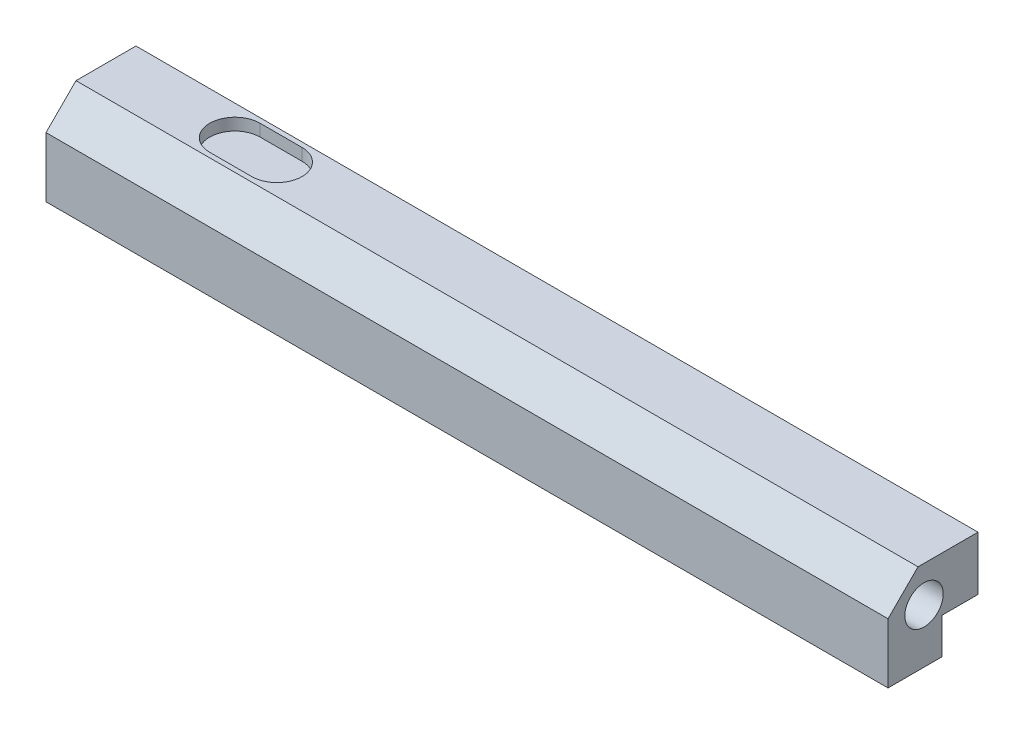
ISO-10303-21;
HEADER;
FILE_DESCRIPTION(('STEP AP214'),'2;1');
FILE_NAME('part.step','',(''),(''),'','','');
FILE_SCHEMA(('AUTOMOTIVE_DESIGN { 1 0 10303 214 1 1 1 1 }'));
ENDSEC;
DATA;
#1=APPLICATION_CONTEXT('core data for automotive mechanical design processes');
#2=APPLICATION_PROTOCOL_DEFINITION('international standard','automotive_design',2000,#1);
#3=PRODUCT_CONTEXT('',#1,'mechanical');
#4=PRODUCT('Part','Part','',(#3));
#5=PRODUCT_RELATED_PRODUCT_CATEGORY('part','',(#4));
#6=PRODUCT_DEFINITION_FORMATION('','',#4);
#7=PRODUCT_DEFINITION_CONTEXT('part definition',#1,'design');
#8=PRODUCT_DEFINITION('design','',#6,#7);
#9=PRODUCT_DEFINITION_SHAPE('','',#8);
#10=(LENGTH_UNIT() NAMED_UNIT(*) SI_UNIT(.MILLI.,.METRE.));
#11=(NAMED_UNIT(*) PLANE_ANGLE_UNIT() SI_UNIT($,.RADIAN.));
#12=(NAMED_UNIT(*) SI_UNIT($,.STERADIAN.) SOLID_ANGLE_UNIT());
#13=UNCERTAINTY_MEASURE_WITH_UNIT(LENGTH_MEASURE(1.E-05),#10,'distance_accuracy_value','');
#14=(GEOMETRIC_REPRESENTATION_CONTEXT(3) GLOBAL_UNCERTAINTY_ASSIGNED_CONTEXT((#13)) GLOBAL_UNIT_ASSIGNED_CONTEXT((#10,
#11,#12)) REPRESENTATION_CONTEXT('',''));
#15=CARTESIAN_POINT('',(0.,0.,0.));
#16=DIRECTION('',(0.,0.,1.));
#17=DIRECTION('',(1.,0.,0.));
#18=AXIS2_PLACEMENT_3D('',#15,#16,#17);
#19=CARTESIAN_POINT('',(70.2,-1.5,-1.5));
#20=DIRECTION('',(-1.,0.,0.));
#21=DIRECTION('',(0.,0.,1.));
#22=AXIS2_PLACEMENT_3D('',#19,#20,#21);
#23=CYLINDRICAL_SURFACE('',#22,2.35);
#24=CARTESIAN_POINT('',(-63.2,-1.5,-1.5));
#25=DIRECTION('',(-1.,0.,0.));
#26=DIRECTION('',(0.,0.,1.));
#27=AXIS2_PLACEMENT_3D('',#24,#25,#26);
#28=CIRCLE('',#27,2.35);
#29=CARTESIAN_POINT('',(-63.2,-1.5,0.849999999999998));
#30=VERTEX_POINT('',#29);
#31=EDGE_CURVE('E189',#30,#30,#28,.T.);
#32=ORIENTED_EDGE('',*,*,#31,.T.);
#33=EDGE_LOOP('',(#32));
#34=FACE_BOUND('',#33,.T.);
#35=CARTESIAN_POINT('',(63.2,-1.5,-1.5));
#36=DIRECTION('',(1.,0.,0.));
#37=DIRECTION('',(0.,0.,-1.));
#38=AXIS2_PLACEMENT_3D('',#35,#36,#37);
#39=CIRCLE('',#38,2.35);
#40=CARTESIAN_POINT('',(63.2,-1.5,-3.85));
#41=VERTEX_POINT('',#40);
#42=EDGE_CURVE('E175',#41,#41,#39,.T.);
#43=ORIENTED_EDGE('',*,*,#42,.T.);
#44=EDGE_LOOP('',(#43));
#45=FACE_BOUND('',#44,.T.);
#46=ADVANCED_FACE('F45',(#34,#45),#23,.F.);
#47=CARTESIAN_POINT('',(70.2,0.,0.));
#48=DIRECTION('',(-1.,0.,0.));
#49=DIRECTION('',(0.,0.,1.));
#50=AXIS2_PLACEMENT_3D('',#47,#48,#49);
#51=PLANE('',#50);
#52=CARTESIAN_POINT('',(70.2,-1.5,-1.5));
#53=DIRECTION('',(1.,0.,0.));
#54=DIRECTION('',(0.,0.,-1.));
#55=AXIS2_PLACEMENT_3D('',#52,#53,#54);
#56=CIRCLE('',#55,3.2);
#57=CARTESIAN_POINT('',(70.2,-1.5,-4.7));
#58=VERTEX_POINT('',#57);
#59=EDGE_CURVE('E184',#58,#58,#56,.T.);
#60=ORIENTED_EDGE('',*,*,#59,.F.);
#61=EDGE_LOOP('',(#60));
#62=FACE_BOUND('',#61,.T.);
#63=DIRECTION('',(0.,0.,1.));
#64=VECTOR('',#63,1.);
#65=CARTESIAN_POINT('',(70.2,4.5,4.5));
#66=LINE('',#65,#64);
#67=CARTESIAN_POINT('',(70.2,4.5,-10.5));
#68=VERTEX_POINT('',#67);
#69=CARTESIAN_POINT('',(70.2,4.5,-0.500000000000033));
#70=VERTEX_POINT('',#69);
#71=EDGE_CURVE('E219',#68,#70,#66,.T.);
#72=ORIENTED_EDGE('',*,*,#71,.T.);
#73=DIRECTION('',(0.,0.707106781186546,-0.707106781186549));
#74=VECTOR('',#73,1.);
#75=CARTESIAN_POINT('',(70.2,-0.500000000000004,4.5));
#76=LINE('',#75,#74);
#77=CARTESIAN_POINT('',(70.2,-0.500000000000004,4.5));
#78=VERTEX_POINT('',#77);
#79=EDGE_CURVE('E11',#70,#78,#76,.F.);
#80=ORIENTED_EDGE('',*,*,#79,.T.);
#81=DIRECTION('',(0.,-1.,0.));
#82=VECTOR('',#81,1.);
#83=CARTESIAN_POINT('',(70.2,-10.5,4.5));
#84=LINE('',#83,#82);
#85=CARTESIAN_POINT('',(70.2,-10.5,4.5));
#86=VERTEX_POINT('',#85);
#87=EDGE_CURVE('E222',#78,#86,#84,.T.);
#88=ORIENTED_EDGE('',*,*,#87,.T.);
#89=DIRECTION('',(0.,0.,-1.));
#90=VECTOR('',#89,1.);
#91=CARTESIAN_POINT('',(70.2,-10.5,-4.5));
#92=LINE('',#91,#90);
#93=CARTESIAN_POINT('',(70.2,-10.5,-4.5));
#94=VERTEX_POINT('',#93);
#95=EDGE_CURVE('E205',#86,#94,#92,.T.);
#96=ORIENTED_EDGE('',*,*,#95,.T.);
#97=DIRECTION('',(0.,1.,0.));
#98=VECTOR('',#97,1.);
#99=CARTESIAN_POINT('',(70.2,-4.5,-4.5));
#100=LINE('',#99,#98);
#101=CARTESIAN_POINT('',(70.2,-4.5,-4.5));
#102=VERTEX_POINT('',#101);
#103=EDGE_CURVE('E209',#94,#102,#100,.T.);
#104=ORIENTED_EDGE('',*,*,#103,.T.);
#105=DIRECTION('',(0.,0.,-1.));
#106=VECTOR('',#105,1.);
#107=CARTESIAN_POINT('',(70.2,-4.5,-10.5));
#108=LINE('',#107,#106);
#109=CARTESIAN_POINT('',(70.2,-4.5,-10.5));
#110=VERTEX_POINT('',#109);
#111=EDGE_CURVE('E213',#102,#110,#108,.T.);
#112=ORIENTED_EDGE('',*,*,#111,.T.);
#113=DIRECTION('',(0.,1.,0.));
#114=VECTOR('',#113,1.);
#115=CARTESIAN_POINT('',(70.2,4.5,-10.5));
#116=LINE('',#115,#114);
#117=EDGE_CURVE('E216',#110,#68,#116,.T.);
#118=ORIENTED_EDGE('',*,*,#117,.T.);
#119=EDGE_LOOP('',(#72,#80,#88,#96,#104,#112,#118));
#120=FACE_BOUND('',#119,.T.);
#121=ADVANCED_FACE('F282',(#62,#120),#51,.F.);
#122=CARTESIAN_POINT('',(-70.2,0.,0.));
#123=DIRECTION('',(-1.,0.,0.));
#124=DIRECTION('',(0.,0.,1.));
#125=AXIS2_PLACEMENT_3D('',#122,#123,#124);
#126=PLANE('',#125);
#127=CARTESIAN_POINT('',(-70.2,-1.5,-1.5));
#128=DIRECTION('',(-1.,0.,0.));
#129=DIRECTION('',(0.,0.,1.));
#130=AXIS2_PLACEMENT_3D('',#127,#128,#129);
#131=CIRCLE('',#130,3.2);
#132=CARTESIAN_POINT('',(-70.2,-1.5,1.7));
#133=VERTEX_POINT('',#132);
#134=EDGE_CURVE('E196',#133,#133,#131,.T.);
#135=ORIENTED_EDGE('',*,*,#134,.F.);
#136=EDGE_LOOP('',(#135));
#137=FACE_BOUND('',#136,.T.);
#138=DIRECTION('',(0.,-1.,0.));
#139=VECTOR('',#138,1.);
#140=CARTESIAN_POINT('',(-70.2,-10.5,4.5));
#141=LINE('',#140,#139);
#142=CARTESIAN_POINT('',(-70.2,-0.500000000000004,4.5));
#143=VERTEX_POINT('',#142);
#144=CARTESIAN_POINT('',(-70.2,-10.5,4.5));
#145=VERTEX_POINT('',#144);
#146=EDGE_CURVE('E210',#143,#145,#141,.T.);
#147=ORIENTED_EDGE('',*,*,#146,.F.);
#148=DIRECTION('',(0.,-0.707106781186546,0.707106781186549));
#149=VECTOR('',#148,1.);
#150=CARTESIAN_POINT('',(-70.2,2.,1.99999999999998));
#151=LINE('',#150,#149);
#152=CARTESIAN_POINT('',(-70.2,4.5,-0.500000000000033));
#153=VERTEX_POINT('',#152);
#154=EDGE_CURVE('E266',#143,#153,#151,.F.);
#155=ORIENTED_EDGE('',*,*,#154,.T.);
#156=DIRECTION('',(0.,0.,1.));
#157=VECTOR('',#156,1.);
#158=CARTESIAN_POINT('',(-70.2,4.5,4.5));
#159=LINE('',#158,#157);
#160=CARTESIAN_POINT('',(-70.2,4.5,-10.5));
#161=VERTEX_POINT('',#160);
#162=EDGE_CURVE('E238',#161,#153,#159,.T.);
#163=ORIENTED_EDGE('',*,*,#162,.F.);
#164=DIRECTION('',(0.,1.,0.));
#165=VECTOR('',#164,1.);
#166=CARTESIAN_POINT('',(-70.2,4.5,-10.5));
#167=LINE('',#166,#165);
#168=CARTESIAN_POINT('',(-70.2,-4.5,-10.5));
#169=VERTEX_POINT('',#168);
#170=EDGE_CURVE('E235',#169,#161,#167,.T.);
#171=ORIENTED_EDGE('',*,*,#170,.F.);
#172=DIRECTION('',(0.,0.,-1.));
#173=VECTOR('',#172,1.);
#174=CARTESIAN_POINT('',(-70.2,-4.5,-10.5));
#175=LINE('',#174,#173);
#176=CARTESIAN_POINT('',(-70.2,-4.5,-4.5));
#177=VERTEX_POINT('',#176);
#178=EDGE_CURVE('E232',#177,#169,#175,.T.);
#179=ORIENTED_EDGE('',*,*,#178,.F.);
#180=DIRECTION('',(0.,1.,0.));
#181=VECTOR('',#180,1.);
#182=CARTESIAN_POINT('',(-70.2,-4.5,-4.5));
#183=LINE('',#182,#181);
#184=CARTESIAN_POINT('',(-70.2,-10.5,-4.5));
#185=VERTEX_POINT('',#184);
#186=EDGE_CURVE('E229',#185,#177,#183,.T.);
#187=ORIENTED_EDGE('',*,*,#186,.F.);
#188=DIRECTION('',(0.,0.,-1.));
#189=VECTOR('',#188,1.);
#190=CARTESIAN_POINT('',(-70.2,-10.5,-4.5));
#191=LINE('',#190,#189);
#192=EDGE_CURVE('E201',#145,#185,#191,.T.);
#193=ORIENTED_EDGE('',*,*,#192,.F.);
#194=EDGE_LOOP('',(#147,#155,#163,#171,#179,#187,#193));
#195=FACE_BOUND('',#194,.T.);
#196=ADVANCED_FACE('F272',(#137,#195),#126,.T.);
#197=CARTESIAN_POINT('',(70.2,-10.5,-4.5));
#198=DIRECTION('',(0.,1.,0.));
#199=DIRECTION('',(0.,0.,1.));
#200=AXIS2_PLACEMENT_3D('',#197,#198,#199);
#201=PLANE('',#200);
#202=ORIENTED_EDGE('',*,*,#192,.T.);
#203=DIRECTION('',(-1.,0.,0.));
#204=VECTOR('',#203,1.);
#205=CARTESIAN_POINT('',(70.2,-10.5,-4.5));
#206=LINE('',#205,#204);
#207=EDGE_CURVE('E258',#94,#185,#206,.T.);
#208=ORIENTED_EDGE('',*,*,#207,.F.);
#209=ORIENTED_EDGE('',*,*,#95,.F.);
#210=DIRECTION('',(-1.,0.,0.));
#211=VECTOR('',#210,1.);
#212=CARTESIAN_POINT('',(70.2,-10.5,4.5));
#213=LINE('',#212,#211);
#214=EDGE_CURVE('E225',#86,#145,#213,.T.);
#215=ORIENTED_EDGE('',*,*,#214,.T.);
#216=EDGE_LOOP('',(#202,#208,#209,#215));
#217=FACE_BOUND('',#216,.T.);
#218=ADVANCED_FACE('F289',(#217),#201,.F.);
#219=CARTESIAN_POINT('',(70.2,-4.5,-4.5));
#220=DIRECTION('',(0.,0.,1.));
#221=DIRECTION('',(1.,0.,0.));
#222=AXIS2_PLACEMENT_3D('',#219,#220,#221);
#223=PLANE('',#222);
#224=ORIENTED_EDGE('',*,*,#186,.T.);
#225=DIRECTION('',(-1.,0.,0.));
#226=VECTOR('',#225,1.);
#227=CARTESIAN_POINT('',(70.2,-4.5,-4.5));
#228=LINE('',#227,#226);
#229=EDGE_CURVE('E254',#102,#177,#228,.T.);
#230=ORIENTED_EDGE('',*,*,#229,.F.);
#231=ORIENTED_EDGE('',*,*,#103,.F.);
#232=ORIENTED_EDGE('',*,*,#207,.T.);
#233=EDGE_LOOP('',(#224,#230,#231,#232));
#234=FACE_BOUND('',#233,.T.);
#235=ADVANCED_FACE('F294',(#234),#223,.F.);
#236=CARTESIAN_POINT('',(70.2,-4.5,-10.5));
#237=DIRECTION('',(0.,1.,0.));
#238=DIRECTION('',(0.,0.,1.));
#239=AXIS2_PLACEMENT_3D('',#236,#237,#238);
#240=PLANE('',#239);
#241=ORIENTED_EDGE('',*,*,#178,.T.);
#242=DIRECTION('',(-1.,0.,0.));
#243=VECTOR('',#242,1.);
#244=CARTESIAN_POINT('',(70.2,-4.5,-10.5));
#245=LINE('',#244,#243);
#246=EDGE_CURVE('E250',#110,#169,#245,.T.);
#247=ORIENTED_EDGE('',*,*,#246,.F.);
#248=ORIENTED_EDGE('',*,*,#111,.F.);
#249=ORIENTED_EDGE('',*,*,#229,.T.);
#250=EDGE_LOOP('',(#241,#247,#248,#249));
#251=FACE_BOUND('',#250,.T.);
#252=ADVANCED_FACE('F297',(#251),#240,.F.);
#253=CARTESIAN_POINT('',(70.2,4.5,-10.5));
#254=DIRECTION('',(0.,0.,1.));
#255=DIRECTION('',(0.,-1.,0.));
#256=AXIS2_PLACEMENT_3D('',#253,#254,#255);
#257=PLANE('',#256);
#258=ORIENTED_EDGE('',*,*,#170,.T.);
#259=DIRECTION('',(-1.,0.,0.));
#260=VECTOR('',#259,1.);
#261=CARTESIAN_POINT('',(70.2,4.5,-10.5));
#262=LINE('',#261,#260);
#263=EDGE_CURVE('E246',#68,#161,#262,.T.);
#264=ORIENTED_EDGE('',*,*,#263,.F.);
#265=ORIENTED_EDGE('',*,*,#117,.F.);
#266=ORIENTED_EDGE('',*,*,#246,.T.);
#267=EDGE_LOOP('',(#258,#264,#265,#266));
#268=FACE_BOUND('',#267,.T.);
#269=ADVANCED_FACE('F300',(#268),#257,.F.);
#270=CARTESIAN_POINT('',(70.2,4.5,4.5));
#271=DIRECTION('',(0.,-1.,0.));
#272=DIRECTION('',(0.,0.,-1.));
#273=AXIS2_PLACEMENT_3D('',#270,#271,#272);
#274=PLANE('',#273);
#275=DIRECTION('',(1.,0.,0.));
#276=VECTOR('',#275,1.);
#277=CARTESIAN_POINT('',(-48.7,4.5,-1.30000000000002));
#278=LINE('',#277,#276);
#279=CARTESIAN_POINT('',(-48.7,4.5,-1.30000000000002));
#280=VERTEX_POINT('',#279);
#281=CARTESIAN_POINT('',(-41.7,4.5,-1.30000000000002));
#282=VERTEX_POINT('',#281);
#283=EDGE_CURVE('E166',#280,#282,#278,.T.);
#284=ORIENTED_EDGE('',*,*,#283,.F.);
#285=CARTESIAN_POINT('',(-48.7,4.5,-5.50000000000002));
#286=DIRECTION('',(0.,1.,0.));
#287=DIRECTION('',(0.,0.,1.));
#288=AXIS2_PLACEMENT_3D('',#285,#286,#287);
#289=CIRCLE('',#288,4.2);
#290=CARTESIAN_POINT('',(-48.7,4.5,-9.70000000000001));
#291=VERTEX_POINT('',#290);
#292=EDGE_CURVE('E62',#291,#280,#289,.T.);
#293=ORIENTED_EDGE('',*,*,#292,.F.);
#294=DIRECTION('',(-1.,0.,0.));
#295=VECTOR('',#294,1.);
#296=CARTESIAN_POINT('',(-48.7,4.5,-9.70000000000001));
#297=LINE('',#296,#295);
#298=CARTESIAN_POINT('',(-41.7,4.5,-9.70000000000002));
#299=VERTEX_POINT('',#298);
#300=EDGE_CURVE('E153',#299,#291,#297,.T.);
#301=ORIENTED_EDGE('',*,*,#300,.F.);
#302=CARTESIAN_POINT('',(-41.7,4.5,-5.50000000000002));
#303=DIRECTION('',(0.,1.,0.));
#304=DIRECTION('',(0.,0.,1.));
#305=AXIS2_PLACEMENT_3D('',#302,#303,#304);
#306=CIRCLE('',#305,4.2);
#307=EDGE_CURVE('E157',#282,#299,#306,.T.);
#308=ORIENTED_EDGE('',*,*,#307,.F.);
#309=EDGE_LOOP('',(#284,#293,#301,#308));
#310=FACE_BOUND('',#309,.T.);
#311=ORIENTED_EDGE('',*,*,#162,.T.);
#312=DIRECTION('',(1.,0.,0.));
#313=VECTOR('',#312,1.);
#314=CARTESIAN_POINT('',(70.2,4.5,-0.500000000000033));
#315=LINE('',#314,#313);
#316=EDGE_CURVE('E55',#153,#70,#315,.T.);
#317=ORIENTED_EDGE('',*,*,#316,.T.);
#318=ORIENTED_EDGE('',*,*,#71,.F.);
#319=ORIENTED_EDGE('',*,*,#263,.T.);
#320=EDGE_LOOP('',(#311,#317,#318,#319));
#321=FACE_BOUND('',#320,.T.);
#322=ADVANCED_FACE('F277',(#310,#321),#274,.F.);
#323=CARTESIAN_POINT('',(70.2,-10.5,4.5));
#324=DIRECTION('',(0.,0.,-1.));
#325=DIRECTION('',(-1.,0.,0.));
#326=AXIS2_PLACEMENT_3D('',#323,#324,#325);
#327=PLANE('',#326);
#328=ORIENTED_EDGE('',*,*,#87,.F.);
#329=DIRECTION('',(-1.,0.,0.));
#330=VECTOR('',#329,1.);
#331=CARTESIAN_POINT('',(70.2,-0.500000000000004,4.5));
#332=LINE('',#331,#330);
#333=EDGE_CURVE('E262',#78,#143,#332,.T.);
#334=ORIENTED_EDGE('',*,*,#333,.T.);
#335=ORIENTED_EDGE('',*,*,#146,.T.);
#336=ORIENTED_EDGE('',*,*,#214,.F.);
#337=EDGE_LOOP('',(#328,#334,#335,#336));
#338=FACE_BOUND('',#337,.T.);
#339=ADVANCED_FACE('F285',(#338),#327,.F.);
#340=CARTESIAN_POINT('',(70.2,-0.500000000000004,4.5));
#341=DIRECTION('',(0.,-0.707106781186549,-0.707106781186545));
#342=DIRECTION('',(-1.,0.,0.));
#343=AXIS2_PLACEMENT_3D('',#340,#341,#342);
#344=PLANE('',#343);
#345=ORIENTED_EDGE('',*,*,#79,.F.);
#346=ORIENTED_EDGE('',*,*,#316,.F.);
#347=ORIENTED_EDGE('',*,*,#154,.F.);
#348=ORIENTED_EDGE('',*,*,#333,.F.);
#349=EDGE_LOOP('',(#345,#346,#347,#348));
#350=FACE_BOUND('',#349,.T.);
#351=ADVANCED_FACE('F48',(#350),#344,.F.);
#352=CARTESIAN_POINT('',(-63.2,-1.5,-1.5));
#353=DIRECTION('',(-1.,0.,0.));
#354=DIRECTION('',(0.,0.,1.));
#355=AXIS2_PLACEMENT_3D('',#352,#353,#354);
#356=CYLINDRICAL_SURFACE('',#355,3.2);
#357=CARTESIAN_POINT('',(-63.2,-1.5,-1.5));
#358=DIRECTION('',(-1.,0.,0.));
#359=DIRECTION('',(0.,0.,1.));
#360=AXIS2_PLACEMENT_3D('',#357,#358,#359);
#361=CIRCLE('',#360,3.2);
#362=CARTESIAN_POINT('',(-63.2,-1.5,1.7));
#363=VERTEX_POINT('',#362);
#364=EDGE_CURVE('E197',#363,#363,#361,.T.);
#365=ORIENTED_EDGE('',*,*,#364,.F.);
#366=EDGE_LOOP('',(#365));
#367=FACE_BOUND('',#366,.T.);
#368=ORIENTED_EDGE('',*,*,#134,.T.);
#369=EDGE_LOOP('',(#368));
#370=FACE_BOUND('',#369,.T.);
#371=ADVANCED_FACE('F320',(#367,#370),#356,.F.);
#372=CARTESIAN_POINT('',(-63.2,-1.5,-1.5));
#373=DIRECTION('',(-1.,0.,0.));
#374=DIRECTION('',(0.,0.,1.));
#375=AXIS2_PLACEMENT_3D('',#372,#373,#374);
#376=PLANE('',#375);
#377=ORIENTED_EDGE('',*,*,#31,.F.);
#378=EDGE_LOOP('',(#377));
#379=FACE_BOUND('',#378,.T.);
#380=ORIENTED_EDGE('',*,*,#364,.T.);
#381=EDGE_LOOP('',(#380));
#382=FACE_BOUND('',#381,.T.);
#383=ADVANCED_FACE('F333',(#379,#382),#376,.T.);
#384=CARTESIAN_POINT('',(63.2,-1.5,-1.5));
#385=DIRECTION('',(1.,0.,0.));
#386=DIRECTION('',(0.,0.,-1.));
#387=AXIS2_PLACEMENT_3D('',#384,#385,#386);
#388=CYLINDRICAL_SURFACE('',#387,3.2);
#389=CARTESIAN_POINT('',(63.2,-1.5,-1.5));
#390=DIRECTION('',(1.,0.,0.));
#391=DIRECTION('',(0.,0.,-1.));
#392=AXIS2_PLACEMENT_3D('',#389,#390,#391);
#393=CIRCLE('',#392,3.2);
#394=CARTESIAN_POINT('',(63.2,-1.5,-4.7));
#395=VERTEX_POINT('',#394);
#396=EDGE_CURVE('E185',#395,#395,#393,.T.);
#397=ORIENTED_EDGE('',*,*,#396,.F.);
#398=EDGE_LOOP('',(#397));
#399=FACE_BOUND('',#398,.T.);
#400=ORIENTED_EDGE('',*,*,#59,.T.);
#401=EDGE_LOOP('',(#400));
#402=FACE_BOUND('',#401,.T.);
#403=ADVANCED_FACE('F338',(#399,#402),#388,.F.);
#404=CARTESIAN_POINT('',(63.2,-1.5,-1.5));
#405=DIRECTION('',(1.,0.,0.));
#406=DIRECTION('',(0.,0.,-1.));
#407=AXIS2_PLACEMENT_3D('',#404,#405,#406);
#408=PLANE('',#407);
#409=ORIENTED_EDGE('',*,*,#42,.F.);
#410=EDGE_LOOP('',(#409));
#411=FACE_BOUND('',#410,.T.);
#412=ORIENTED_EDGE('',*,*,#396,.T.);
#413=EDGE_LOOP('',(#412));
#414=FACE_BOUND('',#413,.T.);
#415=ADVANCED_FACE('F347',(#411,#414),#408,.T.);
#416=CARTESIAN_POINT('',(-48.7,2.5,-5.50000000000002));
#417=DIRECTION('',(0.,1.,0.));
#418=DIRECTION('',(0.,0.,1.));
#419=AXIS2_PLACEMENT_3D('',#416,#417,#418);
#420=CYLINDRICAL_SURFACE('',#419,4.2);
#421=ORIENTED_EDGE('',*,*,#292,.T.);
#422=DIRECTION('',(0.,1.,0.));
#423=VECTOR('',#422,1.);
#424=CARTESIAN_POINT('',(-48.7,2.5,-1.30000000000002));
#425=LINE('',#424,#423);
#426=CARTESIAN_POINT('',(-48.7,2.5,-1.30000000000002));
#427=VERTEX_POINT('',#426);
#428=EDGE_CURVE('E128',#427,#280,#425,.T.);
#429=ORIENTED_EDGE('',*,*,#428,.F.);
#430=CARTESIAN_POINT('',(-48.7,2.5,-5.50000000000002));
#431=DIRECTION('',(0.,1.,0.));
#432=DIRECTION('',(0.,0.,1.));
#433=AXIS2_PLACEMENT_3D('',#430,#431,#432);
#434=CIRCLE('',#433,4.2);
#435=CARTESIAN_POINT('',(-48.7,2.5,-9.70000000000001));
#436=VERTEX_POINT('',#435);
#437=EDGE_CURVE('E132',#436,#427,#434,.T.);
#438=ORIENTED_EDGE('',*,*,#437,.F.);
#439=DIRECTION('',(0.,1.,0.));
#440=VECTOR('',#439,1.);
#441=CARTESIAN_POINT('',(-48.7,2.5,-9.70000000000001));
#442=LINE('',#441,#440);
#443=EDGE_CURVE('E172',#436,#291,#442,.T.);
#444=ORIENTED_EDGE('',*,*,#443,.T.);
#445=EDGE_LOOP('',(#421,#429,#438,#444));
#446=FACE_BOUND('',#445,.T.);
#447=ADVANCED_FACE('F130',(#446),#420,.F.);
#448=CARTESIAN_POINT('',(-48.7,2.5,-9.70000000000001));
#449=DIRECTION('',(0.,0.,-1.));
#450=DIRECTION('',(-1.,0.,0.));
#451=AXIS2_PLACEMENT_3D('',#448,#449,#450);
#452=PLANE('',#451);
#453=ORIENTED_EDGE('',*,*,#300,.T.);
#454=ORIENTED_EDGE('',*,*,#443,.F.);
#455=DIRECTION('',(-1.,0.,0.));
#456=VECTOR('',#455,1.);
#457=CARTESIAN_POINT('',(-48.7,2.5,-9.70000000000001));
#458=LINE('',#457,#456);
#459=CARTESIAN_POINT('',(-41.7,2.5,-9.70000000000002));
#460=VERTEX_POINT('',#459);
#461=EDGE_CURVE('E139',#460,#436,#458,.T.);
#462=ORIENTED_EDGE('',*,*,#461,.F.);
#463=DIRECTION('',(0.,1.,0.));
#464=VECTOR('',#463,1.);
#465=CARTESIAN_POINT('',(-41.7,2.5,-9.70000000000002));
#466=LINE('',#465,#464);
#467=EDGE_CURVE('E176',#460,#299,#466,.T.);
#468=ORIENTED_EDGE('',*,*,#467,.T.);
#469=EDGE_LOOP('',(#453,#454,#462,#468));
#470=FACE_BOUND('',#469,.T.);
#471=ADVANCED_FACE('F357',(#470),#452,.F.);
#472=CARTESIAN_POINT('',(-41.7,2.5,-5.50000000000002));
#473=DIRECTION('',(0.,1.,0.));
#474=DIRECTION('',(0.,0.,1.));
#475=AXIS2_PLACEMENT_3D('',#472,#473,#474);
#476=CYLINDRICAL_SURFACE('',#475,4.2);
#477=ORIENTED_EDGE('',*,*,#307,.T.);
#478=ORIENTED_EDGE('',*,*,#467,.F.);
#479=CARTESIAN_POINT('',(-41.7,2.5,-5.50000000000002));
#480=DIRECTION('',(0.,1.,0.));
#481=DIRECTION('',(0.,0.,1.));
#482=AXIS2_PLACEMENT_3D('',#479,#480,#481);
#483=CIRCLE('',#482,4.2);
#484=CARTESIAN_POINT('',(-41.7,2.5,-1.30000000000002));
#485=VERTEX_POINT('',#484);
#486=EDGE_CURVE('E148',#485,#460,#483,.T.);
#487=ORIENTED_EDGE('',*,*,#486,.F.);
#488=DIRECTION('',(0.,1.,0.));
#489=VECTOR('',#488,1.);
#490=CARTESIAN_POINT('',(-41.7,2.5,-1.30000000000002));
#491=LINE('',#490,#489);
#492=EDGE_CURVE('E138',#485,#282,#491,.T.);
#493=ORIENTED_EDGE('',*,*,#492,.T.);
#494=EDGE_LOOP('',(#477,#478,#487,#493));
#495=FACE_BOUND('',#494,.T.);
#496=ADVANCED_FACE('F360',(#495),#476,.F.);
#497=CARTESIAN_POINT('',(-48.7,2.5,-1.30000000000002));
#498=DIRECTION('',(0.,0.,1.));
#499=DIRECTION('',(1.,0.,0.));
#500=AXIS2_PLACEMENT_3D('',#497,#498,#499);
#501=PLANE('',#500);
#502=ORIENTED_EDGE('',*,*,#283,.T.);
#503=ORIENTED_EDGE('',*,*,#492,.F.);
#504=DIRECTION('',(1.,0.,0.));
#505=VECTOR('',#504,1.);
#506=CARTESIAN_POINT('',(-48.7,2.5,-1.30000000000002));
#507=LINE('',#506,#505);
#508=EDGE_CURVE('E142',#427,#485,#507,.T.);
#509=ORIENTED_EDGE('',*,*,#508,.F.);
#510=ORIENTED_EDGE('',*,*,#428,.T.);
#511=EDGE_LOOP('',(#502,#503,#509,#510));
#512=FACE_BOUND('',#511,.T.);
#513=ADVANCED_FACE('F143',(#512),#501,.F.);
#514=CARTESIAN_POINT('',(-48.7,2.5,-5.50000000000002));
#515=DIRECTION('',(0.,1.,0.));
#516=DIRECTION('',(0.,0.,1.));
#517=AXIS2_PLACEMENT_3D('',#514,#515,#516);
#518=PLANE('',#517);
#519=ORIENTED_EDGE('',*,*,#437,.T.);
#520=ORIENTED_EDGE('',*,*,#508,.T.);
#521=ORIENTED_EDGE('',*,*,#486,.T.);
#522=ORIENTED_EDGE('',*,*,#461,.T.);
#523=EDGE_LOOP('',(#519,#520,#521,#522));
#524=FACE_BOUND('',#523,.T.);
#525=ADVANCED_FACE('F150',(#524),#518,.T.);
#526=CLOSED_SHELL('',(#46,#121,#196,#218,#235,#252,#269,#322,#339,#351,#371,#383,#403,#415,#447,
#471,#496,#513,#525));
#527=MANIFOLD_SOLID_BREP('B2',#526);
#528=ADVANCED_BREP_SHAPE_REPRESENTATION('',(#18,#527),#14);
#529=SHAPE_DEFINITION_REPRESENTATION(#9,#528);
ENDSEC;
END-ISO-10303-21;
